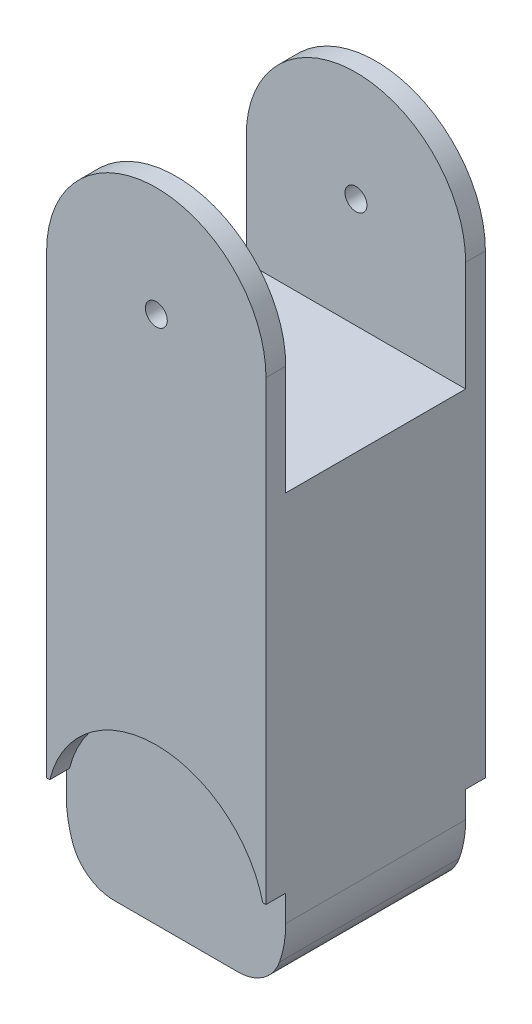
ISO-10303-21;
HEADER;
FILE_DESCRIPTION(('STEP AP214'),'2;1');
FILE_NAME('part.step','',(''),(''),'','','');
FILE_SCHEMA(('AUTOMOTIVE_DESIGN { 1 0 10303 214 1 1 1 1 }'));
ENDSEC;
DATA;
#1=APPLICATION_CONTEXT('core data for automotive mechanical design processes');
#2=APPLICATION_PROTOCOL_DEFINITION('international standard','automotive_design',2000,#1);
#3=PRODUCT_CONTEXT('',#1,'mechanical');
#4=PRODUCT('Part','Part','',(#3));
#5=PRODUCT_RELATED_PRODUCT_CATEGORY('part','',(#4));
#6=PRODUCT_DEFINITION_FORMATION('','',#4);
#7=PRODUCT_DEFINITION_CONTEXT('part definition',#1,'design');
#8=PRODUCT_DEFINITION('design','',#6,#7);
#9=PRODUCT_DEFINITION_SHAPE('','',#8);
#10=(LENGTH_UNIT() NAMED_UNIT(*) SI_UNIT(.MILLI.,.METRE.));
#11=(NAMED_UNIT(*) PLANE_ANGLE_UNIT() SI_UNIT($,.RADIAN.));
#12=(NAMED_UNIT(*) SI_UNIT($,.STERADIAN.) SOLID_ANGLE_UNIT());
#13=UNCERTAINTY_MEASURE_WITH_UNIT(LENGTH_MEASURE(1.E-05),#10,'distance_accuracy_value','');
#14=(GEOMETRIC_REPRESENTATION_CONTEXT(3) GLOBAL_UNCERTAINTY_ASSIGNED_CONTEXT((#13)) GLOBAL_UNIT_ASSIGNED_CONTEXT((#10,
#11,#12)) REPRESENTATION_CONTEXT('',''));
#15=CARTESIAN_POINT('',(0.,0.,0.));
#16=DIRECTION('',(0.,0.,1.));
#17=DIRECTION('',(1.,0.,0.));
#18=AXIS2_PLACEMENT_3D('',#15,#16,#17);
#19=CARTESIAN_POINT('',(25.,100.,25.));
#20=DIRECTION('',(-1.,0.,0.));
#21=DIRECTION('',(0.,0.,1.));
#22=AXIS2_PLACEMENT_3D('',#19,#20,#21);
#23=PLANE('',#22);
#24=DIRECTION('',(0.,0.,-1.));
#25=VECTOR('',#24,1.);
#26=CARTESIAN_POINT('',(25.,15.,25.));
#27=LINE('',#26,#25);
#28=CARTESIAN_POINT('',(25.,15.,20.5));
#29=VERTEX_POINT('',#28);
#30=CARTESIAN_POINT('',(25.,15.,-20.5));
#31=VERTEX_POINT('',#30);
#32=EDGE_CURVE('E192',#29,#31,#27,.T.);
#33=ORIENTED_EDGE('',*,*,#32,.T.);
#34=DIRECTION('',(0.,1.,0.));
#35=VECTOR('',#34,1.);
#36=CARTESIAN_POINT('',(25.,21.,-20.5));
#37=LINE('',#36,#35);
#38=CARTESIAN_POINT('',(25.,21.,-20.5));
#39=VERTEX_POINT('',#38);
#40=EDGE_CURVE('E296',#31,#39,#37,.T.);
#41=ORIENTED_EDGE('',*,*,#40,.T.);
#42=DIRECTION('',(0.,0.,-1.));
#43=VECTOR('',#42,1.);
#44=CARTESIAN_POINT('',(25.,21.,-20.5));
#45=LINE('',#44,#43);
#46=CARTESIAN_POINT('',(25.,21.,-25.));
#47=VERTEX_POINT('',#46);
#48=EDGE_CURVE('E320',#39,#47,#45,.T.);
#49=ORIENTED_EDGE('',*,*,#48,.T.);
#50=DIRECTION('',(0.,-1.,0.));
#51=VECTOR('',#50,1.);
#52=CARTESIAN_POINT('',(25.,100.,-25.));
#53=LINE('',#52,#51);
#54=CARTESIAN_POINT('',(25.,125.,-25.));
#55=VERTEX_POINT('',#54);
#56=EDGE_CURVE('E253',#55,#47,#53,.T.);
#57=ORIENTED_EDGE('',*,*,#56,.F.);
#58=DIRECTION('',(0.,0.,-1.));
#59=VECTOR('',#58,1.);
#60=CARTESIAN_POINT('',(25.,125.,-20.5));
#61=LINE('',#60,#59);
#62=CARTESIAN_POINT('',(25.,125.,-20.5));
#63=VERTEX_POINT('',#62);
#64=EDGE_CURVE('E326',#63,#55,#61,.T.);
#65=ORIENTED_EDGE('',*,*,#64,.F.);
#66=DIRECTION('',(0.,-1.,0.));
#67=VECTOR('',#66,1.);
#68=CARTESIAN_POINT('',(25.,100.,-20.5));
#69=LINE('',#68,#67);
#70=CARTESIAN_POINT('',(25.,100.,-20.5));
#71=VERTEX_POINT('',#70);
#72=EDGE_CURVE('E405',#63,#71,#69,.T.);
#73=ORIENTED_EDGE('',*,*,#72,.T.);
#74=DIRECTION('',(0.,0.,-1.));
#75=VECTOR('',#74,1.);
#76=CARTESIAN_POINT('',(25.,100.,25.));
#77=LINE('',#76,#75);
#78=CARTESIAN_POINT('',(25.,100.,20.5));
#79=VERTEX_POINT('',#78);
#80=EDGE_CURVE('E230',#79,#71,#77,.T.);
#81=ORIENTED_EDGE('',*,*,#80,.F.);
#82=DIRECTION('',(0.,-1.,0.));
#83=VECTOR('',#82,1.);
#84=CARTESIAN_POINT('',(25.,100.,20.5));
#85=LINE('',#84,#83);
#86=CARTESIAN_POINT('',(25.,125.,20.5));
#87=VERTEX_POINT('',#86);
#88=EDGE_CURVE('E371',#87,#79,#85,.T.);
#89=ORIENTED_EDGE('',*,*,#88,.F.);
#90=DIRECTION('',(0.,0.,1.));
#91=VECTOR('',#90,1.);
#92=CARTESIAN_POINT('',(25.,125.,20.5));
#93=LINE('',#92,#91);
#94=CARTESIAN_POINT('',(25.,125.,25.));
#95=VERTEX_POINT('',#94);
#96=EDGE_CURVE('E385',#87,#95,#93,.T.);
#97=ORIENTED_EDGE('',*,*,#96,.T.);
#98=DIRECTION('',(0.,-1.,0.));
#99=VECTOR('',#98,1.);
#100=CARTESIAN_POINT('',(25.,100.,25.));
#101=LINE('',#100,#99);
#102=CARTESIAN_POINT('',(25.,21.,25.));
#103=VERTEX_POINT('',#102);
#104=EDGE_CURVE('E242',#95,#103,#101,.T.);
#105=ORIENTED_EDGE('',*,*,#104,.T.);
#106=DIRECTION('',(0.,0.,1.));
#107=VECTOR('',#106,1.);
#108=CARTESIAN_POINT('',(25.,21.,20.5));
#109=LINE('',#108,#107);
#110=CARTESIAN_POINT('',(25.,21.,20.5));
#111=VERTEX_POINT('',#110);
#112=EDGE_CURVE('E202',#111,#103,#109,.T.);
#113=ORIENTED_EDGE('',*,*,#112,.F.);
#114=DIRECTION('',(0.,1.,0.));
#115=VECTOR('',#114,1.);
#116=CARTESIAN_POINT('',(25.,21.,20.5));
#117=LINE('',#116,#115);
#118=EDGE_CURVE('E181',#29,#111,#117,.T.);
#119=ORIENTED_EDGE('',*,*,#118,.F.);
#120=EDGE_LOOP('',(#33,#41,#49,#57,#65,#73,#81,#89,#97,#105,#113,#119));
#121=FACE_BOUND('',#120,.T.);
#122=ADVANCED_FACE('F38',(#121),#23,.F.);
#123=CARTESIAN_POINT('',(-25.,100.,-25.));
#124=DIRECTION('',(0.,0.,1.));
#125=DIRECTION('',(1.,0.,0.));
#126=AXIS2_PLACEMENT_3D('',#123,#124,#125);
#127=PLANE('',#126);
#128=DIRECTION('',(-1.,0.,0.));
#129=VECTOR('',#128,1.);
#130=CARTESIAN_POINT('',(24.2693221990232,21.,-25.));
#131=LINE('',#130,#129);
#132=CARTESIAN_POINT('',(24.2693221990232,21.,-25.));
#133=VERTEX_POINT('',#132);
#134=EDGE_CURVE('E321',#47,#133,#131,.T.);
#135=ORIENTED_EDGE('',*,*,#134,.T.);
#136=CARTESIAN_POINT('',(0.,15.,-25.));
#137=DIRECTION('',(0.,0.,1.));
#138=DIRECTION('',(-1.,0.,0.));
#139=AXIS2_PLACEMENT_3D('',#136,#137,#138);
#140=CIRCLE('',#139,25.);
#141=CARTESIAN_POINT('',(-24.2693221990232,21.,-25.));
#142=VERTEX_POINT('',#141);
#143=EDGE_CURVE('E308',#133,#142,#140,.T.);
#144=ORIENTED_EDGE('',*,*,#143,.T.);
#145=DIRECTION('',(-1.,0.,0.));
#146=VECTOR('',#145,1.);
#147=CARTESIAN_POINT('',(-25.,21.,-25.));
#148=LINE('',#147,#146);
#149=CARTESIAN_POINT('',(-25.,21.,-25.));
#150=VERTEX_POINT('',#149);
#151=EDGE_CURVE('E325',#142,#150,#148,.T.);
#152=ORIENTED_EDGE('',*,*,#151,.T.);
#153=DIRECTION('',(0.,-1.,0.));
#154=VECTOR('',#153,1.);
#155=CARTESIAN_POINT('',(-25.,100.,-25.));
#156=LINE('',#155,#154);
#157=CARTESIAN_POINT('',(-25.,125.,-25.));
#158=VERTEX_POINT('',#157);
#159=EDGE_CURVE('E249',#158,#150,#156,.T.);
#160=ORIENTED_EDGE('',*,*,#159,.F.);
#161=CARTESIAN_POINT('',(0.,125.,-25.));
#162=DIRECTION('',(0.,0.,-1.));
#163=DIRECTION('',(1.,0.,0.));
#164=AXIS2_PLACEMENT_3D('',#161,#162,#163);
#165=CIRCLE('',#164,25.);
#166=EDGE_CURVE('E401',#158,#55,#165,.T.);
#167=ORIENTED_EDGE('',*,*,#166,.T.);
#168=ORIENTED_EDGE('',*,*,#56,.T.);
#169=EDGE_LOOP('',(#135,#144,#152,#160,#167,#168));
#170=FACE_BOUND('',#169,.T.);
#171=CARTESIAN_POINT('',(0.,125.,-25.));
#172=DIRECTION('',(0.,0.,-1.));
#173=DIRECTION('',(-1.,0.,0.));
#174=AXIS2_PLACEMENT_3D('',#171,#172,#173);
#175=CIRCLE('',#174,2.5);
#176=CARTESIAN_POINT('',(-2.5,125.,-25.));
#177=VERTEX_POINT('',#176);
#178=EDGE_CURVE('E393',#177,#177,#175,.T.);
#179=ORIENTED_EDGE('',*,*,#178,.F.);
#180=EDGE_LOOP('',(#179));
#181=FACE_BOUND('',#180,.T.);
#182=ADVANCED_FACE('F435',(#170,#181),#127,.F.);
#183=CARTESIAN_POINT('',(-25.,100.,25.));
#184=DIRECTION('',(1.,0.,0.));
#185=DIRECTION('',(0.,0.,-1.));
#186=AXIS2_PLACEMENT_3D('',#183,#184,#185);
#187=PLANE('',#186);
#188=DIRECTION('',(0.,-1.,0.));
#189=VECTOR('',#188,1.);
#190=CARTESIAN_POINT('',(-25.,0.,-20.5));
#191=LINE('',#190,#189);
#192=CARTESIAN_POINT('',(-25.,21.,-20.5));
#193=VERTEX_POINT('',#192);
#194=CARTESIAN_POINT('',(-25.,15.,-20.5));
#195=VERTEX_POINT('',#194);
#196=EDGE_CURVE('E306',#193,#195,#191,.T.);
#197=ORIENTED_EDGE('',*,*,#196,.T.);
#198=DIRECTION('',(0.,0.,-1.));
#199=VECTOR('',#198,1.);
#200=CARTESIAN_POINT('',(-25.,15.,25.));
#201=LINE('',#200,#199);
#202=CARTESIAN_POINT('',(-25.,15.,20.5));
#203=VERTEX_POINT('',#202);
#204=EDGE_CURVE('E198',#203,#195,#201,.T.);
#205=ORIENTED_EDGE('',*,*,#204,.F.);
#206=DIRECTION('',(0.,-1.,0.));
#207=VECTOR('',#206,1.);
#208=CARTESIAN_POINT('',(-25.,0.,20.5));
#209=LINE('',#208,#207);
#210=CARTESIAN_POINT('',(-25.,21.,20.5));
#211=VERTEX_POINT('',#210);
#212=EDGE_CURVE('E211',#211,#203,#209,.T.);
#213=ORIENTED_EDGE('',*,*,#212,.F.);
#214=DIRECTION('',(0.,0.,1.));
#215=VECTOR('',#214,1.);
#216=CARTESIAN_POINT('',(-25.,21.,20.5));
#217=LINE('',#216,#215);
#218=CARTESIAN_POINT('',(-25.,21.,25.));
#219=VERTEX_POINT('',#218);
#220=EDGE_CURVE('E231',#211,#219,#217,.T.);
#221=ORIENTED_EDGE('',*,*,#220,.T.);
#222=DIRECTION('',(0.,-1.,0.));
#223=VECTOR('',#222,1.);
#224=CARTESIAN_POINT('',(-25.,100.,25.));
#225=LINE('',#224,#223);
#226=CARTESIAN_POINT('',(-25.,125.,25.));
#227=VERTEX_POINT('',#226);
#228=EDGE_CURVE('E245',#227,#219,#225,.T.);
#229=ORIENTED_EDGE('',*,*,#228,.F.);
#230=DIRECTION('',(0.,0.,1.));
#231=VECTOR('',#230,1.);
#232=CARTESIAN_POINT('',(-25.,125.,20.5));
#233=LINE('',#232,#231);
#234=CARTESIAN_POINT('',(-25.,125.,20.5));
#235=VERTEX_POINT('',#234);
#236=EDGE_CURVE('E389',#235,#227,#233,.T.);
#237=ORIENTED_EDGE('',*,*,#236,.F.);
#238=DIRECTION('',(0.,1.,0.));
#239=VECTOR('',#238,1.);
#240=CARTESIAN_POINT('',(-25.,100.,20.5));
#241=LINE('',#240,#239);
#242=CARTESIAN_POINT('',(-25.,100.,20.5));
#243=VERTEX_POINT('',#242);
#244=EDGE_CURVE('E378',#243,#235,#241,.T.);
#245=ORIENTED_EDGE('',*,*,#244,.F.);
#246=DIRECTION('',(0.,0.,1.));
#247=VECTOR('',#246,1.);
#248=CARTESIAN_POINT('',(-25.,100.,25.));
#249=LINE('',#248,#247);
#250=CARTESIAN_POINT('',(-25.,100.,-20.5));
#251=VERTEX_POINT('',#250);
#252=EDGE_CURVE('E239',#251,#243,#249,.T.);
#253=ORIENTED_EDGE('',*,*,#252,.F.);
#254=DIRECTION('',(0.,1.,0.));
#255=VECTOR('',#254,1.);
#256=CARTESIAN_POINT('',(-25.,100.,-20.5));
#257=LINE('',#256,#255);
#258=CARTESIAN_POINT('',(-25.,125.,-20.5));
#259=VERTEX_POINT('',#258);
#260=EDGE_CURVE('E413',#251,#259,#257,.T.);
#261=ORIENTED_EDGE('',*,*,#260,.T.);
#262=DIRECTION('',(0.,0.,-1.));
#263=VECTOR('',#262,1.);
#264=CARTESIAN_POINT('',(-25.,125.,-20.5));
#265=LINE('',#264,#263);
#266=EDGE_CURVE('E421',#259,#158,#265,.T.);
#267=ORIENTED_EDGE('',*,*,#266,.T.);
#268=ORIENTED_EDGE('',*,*,#159,.T.);
#269=DIRECTION('',(0.,0.,-1.));
#270=VECTOR('',#269,1.);
#271=CARTESIAN_POINT('',(-25.,21.,-20.5));
#272=LINE('',#271,#270);
#273=EDGE_CURVE('E339',#193,#150,#272,.T.);
#274=ORIENTED_EDGE('',*,*,#273,.F.);
#275=EDGE_LOOP('',(#197,#205,#213,#221,#229,#237,#245,#253,#261,#267,#268,#274));
#276=FACE_BOUND('',#275,.T.);
#277=ADVANCED_FACE('F357',(#276),#187,.F.);
#278=CARTESIAN_POINT('',(-25.,100.,25.));
#279=DIRECTION('',(0.,0.,-1.));
#280=DIRECTION('',(-1.,0.,0.));
#281=AXIS2_PLACEMENT_3D('',#278,#279,#280);
#282=PLANE('',#281);
#283=CARTESIAN_POINT('',(0.,15.,25.));
#284=DIRECTION('',(0.,0.,1.));
#285=DIRECTION('',(-1.,0.,0.));
#286=AXIS2_PLACEMENT_3D('',#283,#284,#285);
#287=CIRCLE('',#286,25.);
#288=CARTESIAN_POINT('',(24.2693221990232,21.,25.));
#289=VERTEX_POINT('',#288);
#290=CARTESIAN_POINT('',(-24.2693221990232,21.,25.));
#291=VERTEX_POINT('',#290);
#292=EDGE_CURVE('E219',#289,#291,#287,.T.);
#293=ORIENTED_EDGE('',*,*,#292,.F.);
#294=DIRECTION('',(-1.,0.,0.));
#295=VECTOR('',#294,1.);
#296=CARTESIAN_POINT('',(24.2693221990232,21.,25.));
#297=LINE('',#296,#295);
#298=EDGE_CURVE('E215',#103,#289,#297,.T.);
#299=ORIENTED_EDGE('',*,*,#298,.F.);
#300=ORIENTED_EDGE('',*,*,#104,.F.);
#301=CARTESIAN_POINT('',(0.,125.,25.));
#302=DIRECTION('',(0.,0.,-1.));
#303=DIRECTION('',(1.,0.,0.));
#304=AXIS2_PLACEMENT_3D('',#301,#302,#303);
#305=CIRCLE('',#304,25.);
#306=EDGE_CURVE('E367',#227,#95,#305,.T.);
#307=ORIENTED_EDGE('',*,*,#306,.F.);
#308=ORIENTED_EDGE('',*,*,#228,.T.);
#309=DIRECTION('',(-1.,0.,0.));
#310=VECTOR('',#309,1.);
#311=CARTESIAN_POINT('',(-25.,21.,25.));
#312=LINE('',#311,#310);
#313=EDGE_CURVE('E224',#291,#219,#312,.T.);
#314=ORIENTED_EDGE('',*,*,#313,.F.);
#315=EDGE_LOOP('',(#293,#299,#300,#307,#308,#314));
#316=FACE_BOUND('',#315,.T.);
#317=CARTESIAN_POINT('',(0.,125.,25.));
#318=DIRECTION('',(0.,0.,-1.));
#319=DIRECTION('',(-1.,0.,0.));
#320=AXIS2_PLACEMENT_3D('',#317,#318,#319);
#321=CIRCLE('',#320,2.5);
#322=CARTESIAN_POINT('',(-2.5,125.,25.));
#323=VERTEX_POINT('',#322);
#324=EDGE_CURVE('E188',#323,#323,#321,.T.);
#325=ORIENTED_EDGE('',*,*,#324,.T.);
#326=EDGE_LOOP('',(#325));
#327=FACE_BOUND('',#326,.T.);
#328=ADVANCED_FACE('F621',(#316,#327),#282,.F.);
#329=CARTESIAN_POINT('',(0.,100.,0.));
#330=DIRECTION('',(0.,-1.,0.));
#331=DIRECTION('',(0.,0.,-1.));
#332=AXIS2_PLACEMENT_3D('',#329,#330,#331);
#333=PLANE('',#332);
#334=ORIENTED_EDGE('',*,*,#252,.T.);
#335=DIRECTION('',(-1.,0.,0.));
#336=VECTOR('',#335,1.);
#337=CARTESIAN_POINT('',(25.,100.,20.5));
#338=LINE('',#337,#336);
#339=EDGE_CURVE('E381',#79,#243,#338,.T.);
#340=ORIENTED_EDGE('',*,*,#339,.F.);
#341=ORIENTED_EDGE('',*,*,#80,.T.);
#342=DIRECTION('',(-1.,0.,0.));
#343=VECTOR('',#342,1.);
#344=CARTESIAN_POINT('',(25.,100.,-20.5));
#345=LINE('',#344,#343);
#346=EDGE_CURVE('E409',#71,#251,#345,.T.);
#347=ORIENTED_EDGE('',*,*,#346,.T.);
#348=EDGE_LOOP('',(#334,#340,#341,#347));
#349=FACE_BOUND('',#348,.T.);
#350=ADVANCED_FACE('F612',(#349),#333,.F.);
#351=CARTESIAN_POINT('',(0.,0.,0.));
#352=DIRECTION('',(0.,-1.,0.));
#353=DIRECTION('',(0.,0.,-1.));
#354=AXIS2_PLACEMENT_3D('',#351,#352,#353);
#355=PLANE('',#354);
#356=DIRECTION('',(1.,0.,0.));
#357=VECTOR('',#356,1.);
#358=CARTESIAN_POINT('',(-25.,0.,20.5));
#359=LINE('',#358,#357);
#360=CARTESIAN_POINT('',(-14.1421356237309,0.,20.5));
#361=VERTEX_POINT('',#360);
#362=CARTESIAN_POINT('',(14.1421356237309,0.,20.5));
#363=VERTEX_POINT('',#362);
#364=EDGE_CURVE('E205',#361,#363,#359,.T.);
#365=ORIENTED_EDGE('',*,*,#364,.F.);
#366=DIRECTION('',(0.,0.,1.));
#367=VECTOR('',#366,1.);
#368=CARTESIAN_POINT('',(-14.1421356237309,0.,-20.5));
#369=LINE('',#368,#367);
#370=CARTESIAN_POINT('',(-14.1421356237309,0.,-20.5));
#371=VERTEX_POINT('',#370);
#372=EDGE_CURVE('E272',#361,#371,#369,.F.);
#373=ORIENTED_EDGE('',*,*,#372,.T.);
#374=DIRECTION('',(1.,0.,0.));
#375=VECTOR('',#374,1.);
#376=CARTESIAN_POINT('',(-25.,0.,-20.5));
#377=LINE('',#376,#375);
#378=CARTESIAN_POINT('',(14.1421356237309,0.,-20.5));
#379=VERTEX_POINT('',#378);
#380=EDGE_CURVE('E282',#371,#379,#377,.T.);
#381=ORIENTED_EDGE('',*,*,#380,.T.);
#382=DIRECTION('',(0.,0.,1.));
#383=VECTOR('',#382,1.);
#384=CARTESIAN_POINT('',(14.1421356237309,0.,20.5));
#385=LINE('',#384,#383);
#386=EDGE_CURVE('E269',#379,#363,#385,.T.);
#387=ORIENTED_EDGE('',*,*,#386,.T.);
#388=EDGE_LOOP('',(#365,#373,#381,#387));
#389=FACE_BOUND('',#388,.T.);
#390=ADVANCED_FACE('F294',(#389),#355,.T.);
#391=CARTESIAN_POINT('',(24.2693221990232,21.,20.5));
#392=DIRECTION('',(0.,1.,0.));
#393=DIRECTION('',(0.,0.,1.));
#394=AXIS2_PLACEMENT_3D('',#391,#392,#393);
#395=PLANE('',#394);
#396=ORIENTED_EDGE('',*,*,#298,.T.);
#397=DIRECTION('',(0.,0.,1.));
#398=VECTOR('',#397,1.);
#399=CARTESIAN_POINT('',(24.2693221990232,21.,20.5));
#400=LINE('',#399,#398);
#401=CARTESIAN_POINT('',(24.2693221990232,21.,20.5));
#402=VERTEX_POINT('',#401);
#403=EDGE_CURVE('E204',#402,#289,#400,.T.);
#404=ORIENTED_EDGE('',*,*,#403,.F.);
#405=DIRECTION('',(-1.,0.,0.));
#406=VECTOR('',#405,1.);
#407=CARTESIAN_POINT('',(24.2693221990232,21.,20.5));
#408=LINE('',#407,#406);
#409=EDGE_CURVE('E227',#111,#402,#408,.T.);
#410=ORIENTED_EDGE('',*,*,#409,.F.);
#411=ORIENTED_EDGE('',*,*,#112,.T.);
#412=EDGE_LOOP('',(#396,#404,#410,#411));
#413=FACE_BOUND('',#412,.T.);
#414=ADVANCED_FACE('F594',(#413),#395,.F.);
#415=CARTESIAN_POINT('',(-25.,21.,20.5));
#416=DIRECTION('',(0.,1.,0.));
#417=DIRECTION('',(-1.,0.,0.));
#418=AXIS2_PLACEMENT_3D('',#415,#416,#417);
#419=PLANE('',#418);
#420=ORIENTED_EDGE('',*,*,#313,.T.);
#421=ORIENTED_EDGE('',*,*,#220,.F.);
#422=DIRECTION('',(-1.,0.,0.));
#423=VECTOR('',#422,1.);
#424=CARTESIAN_POINT('',(-25.,21.,20.5));
#425=LINE('',#424,#423);
#426=CARTESIAN_POINT('',(-24.2693221990232,21.,20.5));
#427=VERTEX_POINT('',#426);
#428=EDGE_CURVE('E350',#427,#211,#425,.T.);
#429=ORIENTED_EDGE('',*,*,#428,.F.);
#430=DIRECTION('',(0.,0.,1.));
#431=VECTOR('',#430,1.);
#432=CARTESIAN_POINT('',(-24.2693221990232,21.,20.5));
#433=LINE('',#432,#431);
#434=EDGE_CURVE('E209',#427,#291,#433,.T.);
#435=ORIENTED_EDGE('',*,*,#434,.T.);
#436=EDGE_LOOP('',(#420,#421,#429,#435));
#437=FACE_BOUND('',#436,.T.);
#438=ADVANCED_FACE('F583',(#437),#419,.F.);
#439=CARTESIAN_POINT('',(0.,15.,20.5));
#440=DIRECTION('',(0.,0.,1.));
#441=DIRECTION('',(1.,0.,0.));
#442=AXIS2_PLACEMENT_3D('',#439,#440,#441);
#443=CYLINDRICAL_SURFACE('',#442,25.);
#444=ORIENTED_EDGE('',*,*,#292,.T.);
#445=ORIENTED_EDGE('',*,*,#434,.F.);
#446=CARTESIAN_POINT('',(0.,15.,20.5));
#447=DIRECTION('',(0.,0.,1.));
#448=DIRECTION('',(-1.,0.,0.));
#449=AXIS2_PLACEMENT_3D('',#446,#447,#448);
#450=CIRCLE('',#449,25.);
#451=EDGE_CURVE('E346',#402,#427,#450,.T.);
#452=ORIENTED_EDGE('',*,*,#451,.F.);
#453=ORIENTED_EDGE('',*,*,#403,.T.);
#454=EDGE_LOOP('',(#444,#445,#452,#453));
#455=FACE_BOUND('',#454,.T.);
#456=ADVANCED_FACE('F578',(#455),#443,.F.);
#457=CARTESIAN_POINT('',(0.,15.,20.5));
#458=DIRECTION('',(0.,0.,-1.));
#459=DIRECTION('',(-1.,0.,0.));
#460=AXIS2_PLACEMENT_3D('',#457,#458,#459);
#461=PLANE('',#460);
#462=CARTESIAN_POINT('',(0.,15.,20.5));
#463=DIRECTION('',(0.,0.,-1.));
#464=DIRECTION('',(-1.,0.,0.));
#465=AXIS2_PLACEMENT_3D('',#462,#463,#464);
#466=CIRCLE('',#465,25.);
#467=CARTESIAN_POINT('',(-23.5702260395516,6.66666666666667,20.5));
#468=VERTEX_POINT('',#467);
#469=EDGE_CURVE('E189',#203,#468,#466,.F.);
#470=ORIENTED_EDGE('',*,*,#469,.T.);
#471=CARTESIAN_POINT('',(-14.1421356237309,10.,20.5));
#472=DIRECTION('',(0.,0.,-1.));
#473=DIRECTION('',(-1.,0.,0.));
#474=AXIS2_PLACEMENT_3D('',#471,#472,#473);
#475=CIRCLE('',#474,10.);
#476=EDGE_CURVE('E266',#468,#361,#475,.F.);
#477=ORIENTED_EDGE('',*,*,#476,.T.);
#478=ORIENTED_EDGE('',*,*,#364,.T.);
#479=CARTESIAN_POINT('',(14.1421356237309,10.,20.5));
#480=DIRECTION('',(0.,0.,-1.));
#481=DIRECTION('',(-1.,0.,0.));
#482=AXIS2_PLACEMENT_3D('',#479,#480,#481);
#483=CIRCLE('',#482,10.);
#484=CARTESIAN_POINT('',(23.5702260395516,6.66666666666667,20.5));
#485=VERTEX_POINT('',#484);
#486=EDGE_CURVE('E185',#363,#485,#483,.F.);
#487=ORIENTED_EDGE('',*,*,#486,.T.);
#488=EDGE_CURVE('E175',#485,#29,#466,.F.);
#489=ORIENTED_EDGE('',*,*,#488,.T.);
#490=ORIENTED_EDGE('',*,*,#118,.T.);
#491=ORIENTED_EDGE('',*,*,#409,.T.);
#492=ORIENTED_EDGE('',*,*,#451,.T.);
#493=ORIENTED_EDGE('',*,*,#428,.T.);
#494=ORIENTED_EDGE('',*,*,#212,.T.);
#495=EDGE_LOOP('',(#470,#477,#478,#487,#489,#490,#491,#492,#493,#494));
#496=FACE_BOUND('',#495,.T.);
#497=ADVANCED_FACE('F178',(#496),#461,.F.);
#498=CARTESIAN_POINT('',(24.2693221990232,21.,-20.5));
#499=DIRECTION('',(0.,-1.,0.));
#500=DIRECTION('',(0.,0.,-1.));
#501=AXIS2_PLACEMENT_3D('',#498,#499,#500);
#502=PLANE('',#501);
#503=ORIENTED_EDGE('',*,*,#134,.F.);
#504=ORIENTED_EDGE('',*,*,#48,.F.);
#505=DIRECTION('',(-1.,0.,0.));
#506=VECTOR('',#505,1.);
#507=CARTESIAN_POINT('',(24.2693221990232,21.,-20.5));
#508=LINE('',#507,#506);
#509=CARTESIAN_POINT('',(24.2693221990232,21.,-20.5));
#510=VERTEX_POINT('',#509);
#511=EDGE_CURVE('E299',#39,#510,#508,.T.);
#512=ORIENTED_EDGE('',*,*,#511,.T.);
#513=DIRECTION('',(0.,0.,-1.));
#514=VECTOR('',#513,1.);
#515=CARTESIAN_POINT('',(24.2693221990232,21.,-20.5));
#516=LINE('',#515,#514);
#517=EDGE_CURVE('E220',#510,#133,#516,.T.);
#518=ORIENTED_EDGE('',*,*,#517,.T.);
#519=EDGE_LOOP('',(#503,#504,#512,#518));
#520=FACE_BOUND('',#519,.T.);
#521=ADVANCED_FACE('F445',(#520),#502,.T.);
#522=CARTESIAN_POINT('',(0.,15.,-20.5));
#523=DIRECTION('',(0.,0.,-1.));
#524=DIRECTION('',(-1.,0.,0.));
#525=AXIS2_PLACEMENT_3D('',#522,#523,#524);
#526=CYLINDRICAL_SURFACE('',#525,25.);
#527=ORIENTED_EDGE('',*,*,#143,.F.);
#528=ORIENTED_EDGE('',*,*,#517,.F.);
#529=CARTESIAN_POINT('',(0.,15.,-20.5));
#530=DIRECTION('',(0.,0.,1.));
#531=DIRECTION('',(-1.,0.,0.));
#532=AXIS2_PLACEMENT_3D('',#529,#530,#531);
#533=CIRCLE('',#532,25.);
#534=CARTESIAN_POINT('',(-24.2693221990232,21.,-20.5));
#535=VERTEX_POINT('',#534);
#536=EDGE_CURVE('E317',#510,#535,#533,.T.);
#537=ORIENTED_EDGE('',*,*,#536,.T.);
#538=DIRECTION('',(0.,0.,-1.));
#539=VECTOR('',#538,1.);
#540=CARTESIAN_POINT('',(-24.2693221990232,21.,-20.5));
#541=LINE('',#540,#539);
#542=EDGE_CURVE('E336',#535,#142,#541,.T.);
#543=ORIENTED_EDGE('',*,*,#542,.T.);
#544=EDGE_LOOP('',(#527,#528,#537,#543));
#545=FACE_BOUND('',#544,.T.);
#546=ADVANCED_FACE('F446',(#545),#526,.F.);
#547=CARTESIAN_POINT('',(-25.,21.,-20.5));
#548=DIRECTION('',(0.,-1.,0.));
#549=DIRECTION('',(1.,0.,0.));
#550=AXIS2_PLACEMENT_3D('',#547,#548,#549);
#551=PLANE('',#550);
#552=ORIENTED_EDGE('',*,*,#151,.F.);
#553=ORIENTED_EDGE('',*,*,#542,.F.);
#554=DIRECTION('',(-1.,0.,0.));
#555=VECTOR('',#554,1.);
#556=CARTESIAN_POINT('',(-25.,21.,-20.5));
#557=LINE('',#556,#555);
#558=EDGE_CURVE('E314',#535,#193,#557,.T.);
#559=ORIENTED_EDGE('',*,*,#558,.T.);
#560=ORIENTED_EDGE('',*,*,#273,.T.);
#561=EDGE_LOOP('',(#552,#553,#559,#560));
#562=FACE_BOUND('',#561,.T.);
#563=ADVANCED_FACE('F440',(#562),#551,.T.);
#564=CARTESIAN_POINT('',(0.,15.,-20.5));
#565=DIRECTION('',(0.,0.,1.));
#566=DIRECTION('',(-1.,0.,0.));
#567=AXIS2_PLACEMENT_3D('',#564,#565,#566);
#568=PLANE('',#567);
#569=ORIENTED_EDGE('',*,*,#380,.F.);
#570=CARTESIAN_POINT('',(-14.1421356237309,10.,-20.5));
#571=DIRECTION('',(0.,0.,1.));
#572=DIRECTION('',(1.,0.,0.));
#573=AXIS2_PLACEMENT_3D('',#570,#571,#572);
#574=CIRCLE('',#573,10.);
#575=CARTESIAN_POINT('',(-23.5702260395516,6.66666666666667,-20.5));
#576=VERTEX_POINT('',#575);
#577=EDGE_CURVE('E47',#371,#576,#574,.F.);
#578=ORIENTED_EDGE('',*,*,#577,.T.);
#579=CARTESIAN_POINT('',(0.,15.,-20.5));
#580=DIRECTION('',(0.,0.,1.));
#581=DIRECTION('',(1.,0.,0.));
#582=AXIS2_PLACEMENT_3D('',#579,#580,#581);
#583=CIRCLE('',#582,25.);
#584=EDGE_CURVE('E257',#576,#195,#583,.F.);
#585=ORIENTED_EDGE('',*,*,#584,.T.);
#586=ORIENTED_EDGE('',*,*,#196,.F.);
#587=ORIENTED_EDGE('',*,*,#558,.F.);
#588=ORIENTED_EDGE('',*,*,#536,.F.);
#589=ORIENTED_EDGE('',*,*,#511,.F.);
#590=ORIENTED_EDGE('',*,*,#40,.F.);
#591=CARTESIAN_POINT('',(23.5702260395516,6.66666666666667,-20.5));
#592=VERTEX_POINT('',#591);
#593=EDGE_CURVE('E194',#31,#592,#583,.F.);
#594=ORIENTED_EDGE('',*,*,#593,.T.);
#595=CARTESIAN_POINT('',(14.1421356237309,10.,-20.5));
#596=DIRECTION('',(0.,0.,1.));
#597=DIRECTION('',(1.,0.,0.));
#598=AXIS2_PLACEMENT_3D('',#595,#596,#597);
#599=CIRCLE('',#598,10.);
#600=EDGE_CURVE('E54',#592,#379,#599,.F.);
#601=ORIENTED_EDGE('',*,*,#600,.T.);
#602=EDGE_LOOP('',(#569,#578,#585,#586,#587,#588,#589,#590,#594,#601));
#603=FACE_BOUND('',#602,.T.);
#604=ADVANCED_FACE('F279',(#603),#568,.F.);
#605=CARTESIAN_POINT('',(0.,125.,-20.5));
#606=DIRECTION('',(0.,0.,-1.));
#607=DIRECTION('',(-1.,0.,0.));
#608=AXIS2_PLACEMENT_3D('',#605,#606,#607);
#609=CYLINDRICAL_SURFACE('',#608,25.);
#610=ORIENTED_EDGE('',*,*,#166,.F.);
#611=ORIENTED_EDGE('',*,*,#266,.F.);
#612=CARTESIAN_POINT('',(0.,125.,-20.5));
#613=DIRECTION('',(0.,0.,-1.));
#614=DIRECTION('',(1.,0.,0.));
#615=AXIS2_PLACEMENT_3D('',#612,#613,#614);
#616=CIRCLE('',#615,25.);
#617=EDGE_CURVE('E417',#259,#63,#616,.T.);
#618=ORIENTED_EDGE('',*,*,#617,.T.);
#619=ORIENTED_EDGE('',*,*,#64,.T.);
#620=EDGE_LOOP('',(#610,#611,#618,#619));
#621=FACE_BOUND('',#620,.T.);
#622=ADVANCED_FACE('F433',(#621),#609,.T.);
#623=CARTESIAN_POINT('',(0.,125.,-20.5));
#624=DIRECTION('',(0.,0.,1.));
#625=DIRECTION('',(1.,0.,0.));
#626=AXIS2_PLACEMENT_3D('',#623,#624,#625);
#627=PLANE('',#626);
#628=CARTESIAN_POINT('',(0.,125.,-20.5));
#629=DIRECTION('',(0.,0.,-1.));
#630=DIRECTION('',(-1.,0.,0.));
#631=AXIS2_PLACEMENT_3D('',#628,#629,#630);
#632=CIRCLE('',#631,2.5);
#633=CARTESIAN_POINT('',(-2.5,125.,-20.5));
#634=VERTEX_POINT('',#633);
#635=EDGE_CURVE('E397',#634,#634,#632,.T.);
#636=ORIENTED_EDGE('',*,*,#635,.T.);
#637=EDGE_LOOP('',(#636));
#638=FACE_BOUND('',#637,.T.);
#639=ORIENTED_EDGE('',*,*,#72,.F.);
#640=ORIENTED_EDGE('',*,*,#617,.F.);
#641=ORIENTED_EDGE('',*,*,#260,.F.);
#642=ORIENTED_EDGE('',*,*,#346,.F.);
#643=EDGE_LOOP('',(#639,#640,#641,#642));
#644=FACE_BOUND('',#643,.T.);
#645=ADVANCED_FACE('F488',(#638,#644),#627,.T.);
#646=CARTESIAN_POINT('',(0.,125.,-20.5));
#647=DIRECTION('',(0.,0.,-1.));
#648=DIRECTION('',(-1.,0.,0.));
#649=AXIS2_PLACEMENT_3D('',#646,#647,#648);
#650=CYLINDRICAL_SURFACE('',#649,2.5);
#651=ORIENTED_EDGE('',*,*,#635,.F.);
#652=EDGE_LOOP('',(#651));
#653=FACE_BOUND('',#652,.T.);
#654=ORIENTED_EDGE('',*,*,#178,.T.);
#655=EDGE_LOOP('',(#654));
#656=FACE_BOUND('',#655,.T.);
#657=ADVANCED_FACE('F481',(#653,#656),#650,.F.);
#658=CARTESIAN_POINT('',(0.,125.,20.5));
#659=DIRECTION('',(0.,0.,-1.));
#660=DIRECTION('',(1.,0.,0.));
#661=AXIS2_PLACEMENT_3D('',#658,#659,#660);
#662=PLANE('',#661);
#663=ORIENTED_EDGE('',*,*,#88,.T.);
#664=ORIENTED_EDGE('',*,*,#339,.T.);
#665=ORIENTED_EDGE('',*,*,#244,.T.);
#666=CARTESIAN_POINT('',(0.,125.,20.5));
#667=DIRECTION('',(0.,0.,-1.));
#668=DIRECTION('',(1.,0.,0.));
#669=AXIS2_PLACEMENT_3D('',#666,#667,#668);
#670=CIRCLE('',#669,25.);
#671=EDGE_CURVE('E375',#235,#87,#670,.T.);
#672=ORIENTED_EDGE('',*,*,#671,.T.);
#673=EDGE_LOOP('',(#663,#664,#665,#672));
#674=FACE_BOUND('',#673,.T.);
#675=CARTESIAN_POINT('',(0.,125.,20.5));
#676=DIRECTION('',(0.,0.,-1.));
#677=DIRECTION('',(-1.,0.,0.));
#678=AXIS2_PLACEMENT_3D('',#675,#676,#677);
#679=CIRCLE('',#678,2.5);
#680=CARTESIAN_POINT('',(-2.5,125.,20.5));
#681=VERTEX_POINT('',#680);
#682=EDGE_CURVE('E363',#681,#681,#679,.T.);
#683=ORIENTED_EDGE('',*,*,#682,.F.);
#684=EDGE_LOOP('',(#683));
#685=FACE_BOUND('',#684,.T.);
#686=ADVANCED_FACE('F478',(#674,#685),#662,.T.);
#687=CARTESIAN_POINT('',(0.,125.,20.5));
#688=DIRECTION('',(0.,0.,1.));
#689=DIRECTION('',(1.,0.,0.));
#690=AXIS2_PLACEMENT_3D('',#687,#688,#689);
#691=CYLINDRICAL_SURFACE('',#690,25.);
#692=ORIENTED_EDGE('',*,*,#306,.T.);
#693=ORIENTED_EDGE('',*,*,#96,.F.);
#694=ORIENTED_EDGE('',*,*,#671,.F.);
#695=ORIENTED_EDGE('',*,*,#236,.T.);
#696=EDGE_LOOP('',(#692,#693,#694,#695));
#697=FACE_BOUND('',#696,.T.);
#698=ADVANCED_FACE('F476',(#697),#691,.T.);
#699=CARTESIAN_POINT('',(0.,125.,20.5));
#700=DIRECTION('',(0.,0.,1.));
#701=DIRECTION('',(1.,0.,0.));
#702=AXIS2_PLACEMENT_3D('',#699,#700,#701);
#703=CYLINDRICAL_SURFACE('',#702,2.5);
#704=ORIENTED_EDGE('',*,*,#682,.T.);
#705=EDGE_LOOP('',(#704));
#706=FACE_BOUND('',#705,.T.);
#707=ORIENTED_EDGE('',*,*,#324,.F.);
#708=EDGE_LOOP('',(#707));
#709=FACE_BOUND('',#708,.T.);
#710=ADVANCED_FACE('F472',(#706,#709),#703,.F.);
#711=CARTESIAN_POINT('',(0.,15.,25.));
#712=DIRECTION('',(0.,0.,-1.));
#713=DIRECTION('',(-1.,0.,0.));
#714=AXIS2_PLACEMENT_3D('',#711,#712,#713);
#715=CYLINDRICAL_SURFACE('',#714,25.);
#716=ORIENTED_EDGE('',*,*,#584,.F.);
#717=DIRECTION('',(0.,0.,-1.));
#718=VECTOR('',#717,1.);
#719=CARTESIAN_POINT('',(-23.5702260395516,6.66666666666667,25.));
#720=LINE('',#719,#718);
#721=EDGE_CURVE('E260',#576,#468,#720,.F.);
#722=ORIENTED_EDGE('',*,*,#721,.T.);
#723=ORIENTED_EDGE('',*,*,#469,.F.);
#724=ORIENTED_EDGE('',*,*,#204,.T.);
#725=EDGE_LOOP('',(#716,#722,#723,#724));
#726=FACE_BOUND('',#725,.T.);
#727=ADVANCED_FACE('F287',(#726),#715,.T.);
#728=ORIENTED_EDGE('',*,*,#488,.F.);
#729=DIRECTION('',(0.,0.,-1.));
#730=VECTOR('',#729,1.);
#731=CARTESIAN_POINT('',(23.5702260395516,6.66666666666667,25.));
#732=LINE('',#731,#730);
#733=EDGE_CURVE('E11',#485,#592,#732,.T.);
#734=ORIENTED_EDGE('',*,*,#733,.T.);
#735=ORIENTED_EDGE('',*,*,#593,.F.);
#736=ORIENTED_EDGE('',*,*,#32,.F.);
#737=EDGE_LOOP('',(#728,#734,#735,#736));
#738=FACE_BOUND('',#737,.T.);
#739=ADVANCED_FACE('F193',(#738),#715,.T.);
#740=CARTESIAN_POINT('',(-14.1421356237309,10.,25.));
#741=DIRECTION('',(0.,0.,-1.));
#742=DIRECTION('',(-1.,0.,0.));
#743=AXIS2_PLACEMENT_3D('',#740,#741,#742);
#744=CYLINDRICAL_SURFACE('',#743,10.);
#745=ORIENTED_EDGE('',*,*,#577,.F.);
#746=ORIENTED_EDGE('',*,*,#372,.F.);
#747=ORIENTED_EDGE('',*,*,#476,.F.);
#748=ORIENTED_EDGE('',*,*,#721,.F.);
#749=EDGE_LOOP('',(#745,#746,#747,#748));
#750=FACE_BOUND('',#749,.T.);
#751=ADVANCED_FACE('F290',(#750),#744,.T.);
#752=CARTESIAN_POINT('',(14.1421356237309,10.,25.));
#753=DIRECTION('',(0.,0.,-1.));
#754=DIRECTION('',(-1.,0.,0.));
#755=AXIS2_PLACEMENT_3D('',#752,#753,#754);
#756=CYLINDRICAL_SURFACE('',#755,10.);
#757=ORIENTED_EDGE('',*,*,#486,.F.);
#758=ORIENTED_EDGE('',*,*,#386,.F.);
#759=ORIENTED_EDGE('',*,*,#600,.F.);
#760=ORIENTED_EDGE('',*,*,#733,.F.);
#761=EDGE_LOOP('',(#757,#758,#759,#760));
#762=FACE_BOUND('',#761,.T.);
#763=ADVANCED_FACE('F40',(#762),#756,.T.);
#764=CLOSED_SHELL('',(#122,#182,#277,#328,#350,#390,#414,#438,#456,#497,#521,#546,#563,#604,
#622,#645,#657,#686,#698,#710,#727,#739,#751,#763));
#765=MANIFOLD_SOLID_BREP('B2',#764);
#766=ADVANCED_BREP_SHAPE_REPRESENTATION('',(#18,#765),#14);
#767=SHAPE_DEFINITION_REPRESENTATION(#9,#766);
ENDSEC;
END-ISO-10303-21;
